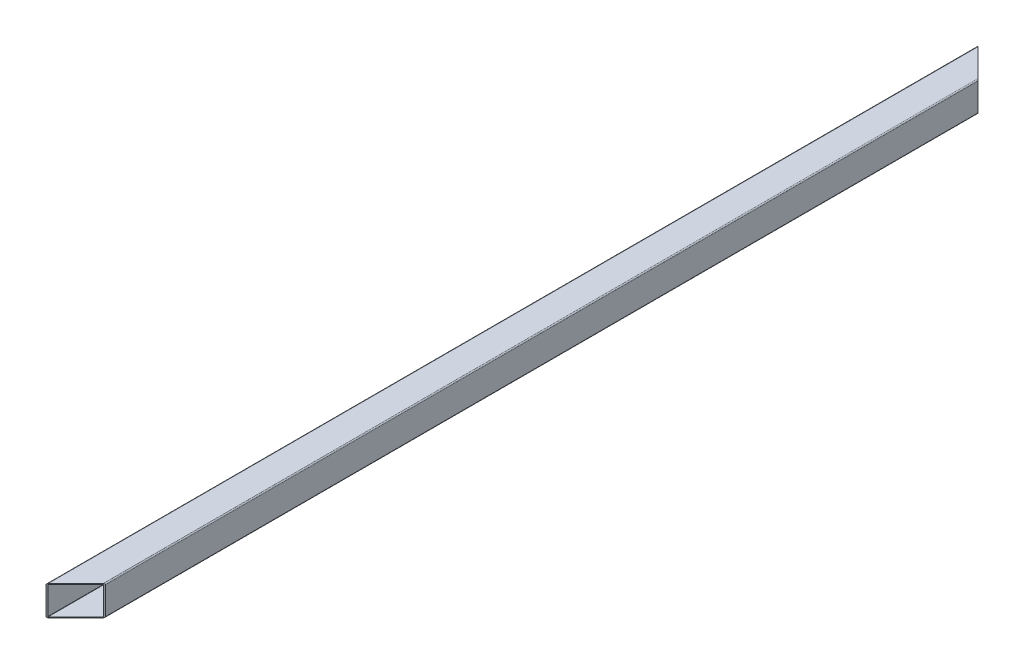
ISO-10303-21;
HEADER;
FILE_DESCRIPTION(('STEP AP214'),'2;1');
FILE_NAME('part.step','',(''),(''),'','','');
FILE_SCHEMA(('AUTOMOTIVE_DESIGN { 1 0 10303 214 1 1 1 1 }'));
ENDSEC;
DATA;
#1=APPLICATION_CONTEXT('core data for automotive mechanical design processes');
#2=APPLICATION_PROTOCOL_DEFINITION('international standard','automotive_design',2000,#1);
#3=PRODUCT_CONTEXT('',#1,'mechanical');
#4=PRODUCT('Part','Part','',(#3));
#5=PRODUCT_RELATED_PRODUCT_CATEGORY('part','',(#4));
#6=PRODUCT_DEFINITION_FORMATION('','',#4);
#7=PRODUCT_DEFINITION_CONTEXT('part definition',#1,'design');
#8=PRODUCT_DEFINITION('design','',#6,#7);
#9=PRODUCT_DEFINITION_SHAPE('','',#8);
#10=(LENGTH_UNIT() NAMED_UNIT(*) SI_UNIT(.MILLI.,.METRE.));
#11=(NAMED_UNIT(*) PLANE_ANGLE_UNIT() SI_UNIT($,.RADIAN.));
#12=(NAMED_UNIT(*) SI_UNIT($,.STERADIAN.) SOLID_ANGLE_UNIT());
#13=UNCERTAINTY_MEASURE_WITH_UNIT(LENGTH_MEASURE(1.E-05),#10,'distance_accuracy_value','');
#14=(GEOMETRIC_REPRESENTATION_CONTEXT(3) GLOBAL_UNCERTAINTY_ASSIGNED_CONTEXT((#13)) GLOBAL_UNIT_ASSIGNED_CONTEXT((#10,
#11,#12)) REPRESENTATION_CONTEXT('',''));
#15=CARTESIAN_POINT('',(0.,0.,0.));
#16=DIRECTION('',(0.,0.,1.));
#17=DIRECTION('',(1.,0.,0.));
#18=AXIS2_PLACEMENT_3D('',#15,#16,#17);
#19=CARTESIAN_POINT('',(-18.5,18.5,-1255.));
#20=DIRECTION('',(0.,0.,1.));
#21=DIRECTION('',(1.,0.,0.));
#22=AXIS2_PLACEMENT_3D('',#19,#20,#21);
#23=CYLINDRICAL_SURFACE('',#22,1.5);
#24=DIRECTION('',(0.,0.,1.));
#25=VECTOR('',#24,1.);
#26=CARTESIAN_POINT('',(-20.,18.5,-1255.));
#27=LINE('',#26,#25);
#28=CARTESIAN_POINT('',(-20.,18.5,-1255.));
#29=VERTEX_POINT('',#28);
#30=CARTESIAN_POINT('',(-20.,18.5,0.));
#31=VERTEX_POINT('',#30);
#32=EDGE_CURVE('E231',#29,#31,#27,.T.);
#33=ORIENTED_EDGE('',*,*,#32,.T.);
#34=CARTESIAN_POINT('',(-18.5,18.5,-1.50000000000006));
#35=DIRECTION('',(-0.707106781186548,0.,-0.707106781186547));
#36=DIRECTION('',(-0.707106781186547,0.,0.707106781186548));
#37=AXIS2_PLACEMENT_3D('',#34,#35,#36);
#38=ELLIPSE('',#37,2.12132034355964,1.5);
#39=CARTESIAN_POINT('',(-18.5,20.,-1.50000000000005));
#40=VERTEX_POINT('',#39);
#41=EDGE_CURVE('E188',#31,#40,#38,.T.);
#42=ORIENTED_EDGE('',*,*,#41,.T.);
#43=DIRECTION('',(0.,0.,1.));
#44=VECTOR('',#43,1.);
#45=CARTESIAN_POINT('',(-18.5,20.,-1255.));
#46=LINE('',#45,#44);
#47=CARTESIAN_POINT('',(-18.5,20.,-1253.5));
#48=VERTEX_POINT('',#47);
#49=EDGE_CURVE('E12',#48,#40,#46,.T.);
#50=ORIENTED_EDGE('',*,*,#49,.F.);
#51=CARTESIAN_POINT('',(-18.5,18.5,-1253.5));
#52=DIRECTION('',(-0.707106781186548,0.,0.707106781186547));
#53=DIRECTION('',(0.707106781186547,0.,0.707106781186548));
#54=AXIS2_PLACEMENT_3D('',#51,#52,#53);
#55=ELLIPSE('',#54,2.12132034355964,1.5);
#56=EDGE_CURVE('E298',#48,#29,#55,.T.);
#57=ORIENTED_EDGE('',*,*,#56,.T.);
#58=EDGE_LOOP('',(#33,#42,#50,#57));
#59=FACE_BOUND('',#58,.T.);
#60=ADVANCED_FACE('F63',(#59),#23,.T.);
#61=CARTESIAN_POINT('',(-18.5,20.,-1255.));
#62=DIRECTION('',(0.,-1.,0.));
#63=DIRECTION('',(0.,0.,-1.));
#64=AXIS2_PLACEMENT_3D('',#61,#62,#63);
#65=PLANE('',#64);
#66=ORIENTED_EDGE('',*,*,#49,.T.);
#67=DIRECTION('',(-0.707106781186547,0.,0.707106781186548));
#68=VECTOR('',#67,1.);
#69=CARTESIAN_POINT('',(-20.,20.,0.));
#70=LINE('',#69,#68);
#71=CARTESIAN_POINT('',(18.5,20.,-38.5000000000001));
#72=VERTEX_POINT('',#71);
#73=EDGE_CURVE('E180',#72,#40,#70,.T.);
#74=ORIENTED_EDGE('',*,*,#73,.F.);
#75=DIRECTION('',(0.,0.,1.));
#76=VECTOR('',#75,1.);
#77=CARTESIAN_POINT('',(18.5,20.,-1255.));
#78=LINE('',#77,#76);
#79=CARTESIAN_POINT('',(18.5,20.,-1216.5));
#80=VERTEX_POINT('',#79);
#81=EDGE_CURVE('E72',#80,#72,#78,.T.);
#82=ORIENTED_EDGE('',*,*,#81,.F.);
#83=DIRECTION('',(0.707106781186547,0.,0.707106781186548));
#84=VECTOR('',#83,1.);
#85=CARTESIAN_POINT('',(-20.,20.,-1255.));
#86=LINE('',#85,#84);
#87=EDGE_CURVE('E272',#48,#80,#86,.T.);
#88=ORIENTED_EDGE('',*,*,#87,.F.);
#89=EDGE_LOOP('',(#66,#74,#82,#88));
#90=FACE_BOUND('',#89,.T.);
#91=ADVANCED_FACE('F192',(#90),#65,.F.);
#92=CARTESIAN_POINT('',(18.5,18.5,-1255.));
#93=DIRECTION('',(0.,0.,1.));
#94=DIRECTION('',(1.,0.,0.));
#95=AXIS2_PLACEMENT_3D('',#92,#93,#94);
#96=CYLINDRICAL_SURFACE('',#95,1.5);
#97=ORIENTED_EDGE('',*,*,#81,.T.);
#98=CARTESIAN_POINT('',(18.5,18.5,-38.5000000000002));
#99=DIRECTION('',(-0.707106781186548,0.,-0.707106781186547));
#100=DIRECTION('',(-0.707106781186547,0.,0.707106781186548));
#101=AXIS2_PLACEMENT_3D('',#98,#99,#100);
#102=ELLIPSE('',#101,2.12132034355964,1.5);
#103=CARTESIAN_POINT('',(20.,18.5,-40.));
#104=VERTEX_POINT('',#103);
#105=EDGE_CURVE('E177',#72,#104,#102,.T.);
#106=ORIENTED_EDGE('',*,*,#105,.T.);
#107=DIRECTION('',(0.,0.,1.));
#108=VECTOR('',#107,1.);
#109=CARTESIAN_POINT('',(20.,18.5,-1255.));
#110=LINE('',#109,#108);
#111=CARTESIAN_POINT('',(20.,18.5,-1215.));
#112=VERTEX_POINT('',#111);
#113=EDGE_CURVE('E200',#112,#104,#110,.T.);
#114=ORIENTED_EDGE('',*,*,#113,.F.);
#115=CARTESIAN_POINT('',(18.5,18.5,-1216.5));
#116=DIRECTION('',(-0.707106781186548,0.,0.707106781186547));
#117=DIRECTION('',(0.707106781186547,0.,0.707106781186548));
#118=AXIS2_PLACEMENT_3D('',#115,#116,#117);
#119=ELLIPSE('',#118,2.12132034355964,1.5);
#120=EDGE_CURVE('E199',#112,#80,#119,.T.);
#121=ORIENTED_EDGE('',*,*,#120,.T.);
#122=EDGE_LOOP('',(#97,#106,#114,#121));
#123=FACE_BOUND('',#122,.T.);
#124=ADVANCED_FACE('F198',(#123),#96,.T.);
#125=CARTESIAN_POINT('',(20.,-18.5,-1255.));
#126=DIRECTION('',(-1.,0.,0.));
#127=DIRECTION('',(0.,0.,1.));
#128=AXIS2_PLACEMENT_3D('',#125,#126,#127);
#129=PLANE('',#128);
#130=ORIENTED_EDGE('',*,*,#113,.T.);
#131=DIRECTION('',(0.,-1.,0.));
#132=VECTOR('',#131,1.);
#133=CARTESIAN_POINT('',(20.,-18.5,-40.));
#134=LINE('',#133,#132);
#135=CARTESIAN_POINT('',(20.,-18.5,-40.0000000000003));
#136=VERTEX_POINT('',#135);
#137=EDGE_CURVE('E183',#104,#136,#134,.T.);
#138=ORIENTED_EDGE('',*,*,#137,.T.);
#139=DIRECTION('',(0.,0.,1.));
#140=VECTOR('',#139,1.);
#141=CARTESIAN_POINT('',(20.,-18.5,-1255.));
#142=LINE('',#141,#140);
#143=CARTESIAN_POINT('',(20.,-18.5,-1215.));
#144=VERTEX_POINT('',#143);
#145=EDGE_CURVE('E202',#144,#136,#142,.T.);
#146=ORIENTED_EDGE('',*,*,#145,.F.);
#147=DIRECTION('',(0.,1.,0.));
#148=VECTOR('',#147,1.);
#149=CARTESIAN_POINT('',(20.,-18.5,-1215.));
#150=LINE('',#149,#148);
#151=EDGE_CURVE('E265',#144,#112,#150,.T.);
#152=ORIENTED_EDGE('',*,*,#151,.T.);
#153=EDGE_LOOP('',(#130,#138,#146,#152));
#154=FACE_BOUND('',#153,.T.);
#155=ADVANCED_FACE('F264',(#154),#129,.F.);
#156=CARTESIAN_POINT('',(18.5,-18.5,-1255.));
#157=DIRECTION('',(0.,0.,1.));
#158=DIRECTION('',(1.,0.,0.));
#159=AXIS2_PLACEMENT_3D('',#156,#157,#158);
#160=CYLINDRICAL_SURFACE('',#159,1.5);
#161=ORIENTED_EDGE('',*,*,#145,.T.);
#162=CARTESIAN_POINT('',(18.5,-18.5,-38.5000000000002));
#163=DIRECTION('',(-0.707106781186548,0.,-0.707106781186547));
#164=DIRECTION('',(-0.707106781186547,0.,0.707106781186548));
#165=AXIS2_PLACEMENT_3D('',#162,#163,#164);
#166=ELLIPSE('',#165,2.12132034355964,1.5);
#167=CARTESIAN_POINT('',(18.5,-20.,-38.5000000000003));
#168=VERTEX_POINT('',#167);
#169=EDGE_CURVE('E260',#136,#168,#166,.T.);
#170=ORIENTED_EDGE('',*,*,#169,.T.);
#171=DIRECTION('',(0.,0.,1.));
#172=VECTOR('',#171,1.);
#173=CARTESIAN_POINT('',(18.5,-20.,-1255.));
#174=LINE('',#173,#172);
#175=CARTESIAN_POINT('',(18.5,-20.,-1216.5));
#176=VERTEX_POINT('',#175);
#177=EDGE_CURVE('E251',#176,#168,#174,.T.);
#178=ORIENTED_EDGE('',*,*,#177,.F.);
#179=CARTESIAN_POINT('',(18.5,-18.5,-1216.5));
#180=DIRECTION('',(-0.707106781186548,0.,0.707106781186547));
#181=DIRECTION('',(0.707106781186547,0.,0.707106781186548));
#182=AXIS2_PLACEMENT_3D('',#179,#180,#181);
#183=ELLIPSE('',#182,2.12132034355964,1.5);
#184=EDGE_CURVE('E261',#176,#144,#183,.T.);
#185=ORIENTED_EDGE('',*,*,#184,.T.);
#186=EDGE_LOOP('',(#161,#170,#178,#185));
#187=FACE_BOUND('',#186,.T.);
#188=ADVANCED_FACE('F258',(#187),#160,.T.);
#189=CARTESIAN_POINT('',(18.5,-20.,-1255.));
#190=DIRECTION('',(0.,1.,0.));
#191=DIRECTION('',(0.,0.,1.));
#192=AXIS2_PLACEMENT_3D('',#189,#190,#191);
#193=PLANE('',#192);
#194=ORIENTED_EDGE('',*,*,#177,.T.);
#195=DIRECTION('',(-0.707106781186547,0.,0.707106781186548));
#196=VECTOR('',#195,1.);
#197=CARTESIAN_POINT('',(626.75,-20.,-646.750000000001));
#198=LINE('',#197,#196);
#199=CARTESIAN_POINT('',(-18.5,-20.,-1.50000000000006));
#200=VERTEX_POINT('',#199);
#201=EDGE_CURVE('E267',#168,#200,#198,.T.);
#202=ORIENTED_EDGE('',*,*,#201,.T.);
#203=DIRECTION('',(0.,0.,1.));
#204=VECTOR('',#203,1.);
#205=CARTESIAN_POINT('',(-18.5,-20.,-1255.));
#206=LINE('',#205,#204);
#207=CARTESIAN_POINT('',(-18.5,-20.,-1253.5));
#208=VERTEX_POINT('',#207);
#209=EDGE_CURVE('E243',#208,#200,#206,.T.);
#210=ORIENTED_EDGE('',*,*,#209,.F.);
#211=DIRECTION('',(0.707106781186547,0.,0.707106781186548));
#212=VECTOR('',#211,1.);
#213=CARTESIAN_POINT('',(-0.750000000000046,-20.,-1235.75));
#214=LINE('',#213,#212);
#215=EDGE_CURVE('E292',#208,#176,#214,.T.);
#216=ORIENTED_EDGE('',*,*,#215,.T.);
#217=EDGE_LOOP('',(#194,#202,#210,#216));
#218=FACE_BOUND('',#217,.T.);
#219=ADVANCED_FACE('F345',(#218),#193,.F.);
#220=CARTESIAN_POINT('',(-18.5,-18.5,-1255.));
#221=DIRECTION('',(0.,0.,1.));
#222=DIRECTION('',(1.,0.,0.));
#223=AXIS2_PLACEMENT_3D('',#220,#221,#222);
#224=CYLINDRICAL_SURFACE('',#223,1.5);
#225=ORIENTED_EDGE('',*,*,#209,.T.);
#226=CARTESIAN_POINT('',(-18.5,-18.5,-1.50000000000006));
#227=DIRECTION('',(-0.707106781186548,0.,-0.707106781186547));
#228=DIRECTION('',(-0.707106781186547,0.,0.707106781186548));
#229=AXIS2_PLACEMENT_3D('',#226,#227,#228);
#230=ELLIPSE('',#229,2.12132034355965,1.5);
#231=CARTESIAN_POINT('',(-20.,-18.5,0.));
#232=VERTEX_POINT('',#231);
#233=EDGE_CURVE('E306',#200,#232,#230,.T.);
#234=ORIENTED_EDGE('',*,*,#233,.T.);
#235=DIRECTION('',(0.,0.,1.));
#236=VECTOR('',#235,1.);
#237=CARTESIAN_POINT('',(-20.,-18.5,-1255.));
#238=LINE('',#237,#236);
#239=CARTESIAN_POINT('',(-20.,-18.5,-1255.));
#240=VERTEX_POINT('',#239);
#241=EDGE_CURVE('E237',#240,#232,#238,.T.);
#242=ORIENTED_EDGE('',*,*,#241,.F.);
#243=CARTESIAN_POINT('',(-18.5,-18.5,-1253.5));
#244=DIRECTION('',(-0.707106781186548,0.,0.707106781186547));
#245=DIRECTION('',(0.707106781186547,0.,0.707106781186548));
#246=AXIS2_PLACEMENT_3D('',#243,#244,#245);
#247=ELLIPSE('',#246,2.12132034355965,1.5);
#248=EDGE_CURVE('E289',#240,#208,#247,.T.);
#249=ORIENTED_EDGE('',*,*,#248,.T.);
#250=EDGE_LOOP('',(#225,#234,#242,#249));
#251=FACE_BOUND('',#250,.T.);
#252=ADVANCED_FACE('F309',(#251),#224,.T.);
#253=CARTESIAN_POINT('',(18.5,18.5,-1255.));
#254=DIRECTION('',(0.,0.,1.));
#255=DIRECTION('',(1.,0.,0.));
#256=AXIS2_PLACEMENT_3D('',#253,#254,#255);
#257=CYLINDRICAL_SURFACE('',#256,0.3);
#258=CARTESIAN_POINT('',(18.5,18.5,-38.5000000000002));
#259=DIRECTION('',(-0.707106781186548,0.,-0.707106781186547));
#260=DIRECTION('',(-0.707106781186547,0.,0.707106781186548));
#261=AXIS2_PLACEMENT_3D('',#258,#259,#260);
#262=ELLIPSE('',#261,0.424264068711929,0.3);
#263=CARTESIAN_POINT('',(18.5,18.8,-38.5000000000002));
#264=VERTEX_POINT('',#263);
#265=CARTESIAN_POINT('',(18.8,18.5,-38.8000000000002));
#266=VERTEX_POINT('',#265);
#267=EDGE_CURVE('E80',#264,#266,#262,.T.);
#268=ORIENTED_EDGE('',*,*,#267,.F.);
#269=DIRECTION('',(0.,0.,1.));
#270=VECTOR('',#269,1.);
#271=CARTESIAN_POINT('',(18.5,18.8,-1255.));
#272=LINE('',#271,#270);
#273=CARTESIAN_POINT('',(18.5,18.8,-1216.5));
#274=VERTEX_POINT('',#273);
#275=EDGE_CURVE('E67',#274,#264,#272,.T.);
#276=ORIENTED_EDGE('',*,*,#275,.F.);
#277=CARTESIAN_POINT('',(18.5,18.5,-1216.5));
#278=DIRECTION('',(-0.707106781186548,0.,0.707106781186547));
#279=DIRECTION('',(0.707106781186547,0.,0.707106781186548));
#280=AXIS2_PLACEMENT_3D('',#277,#278,#279);
#281=ELLIPSE('',#280,0.424264068711929,0.3);
#282=CARTESIAN_POINT('',(18.8,18.5,-1216.2));
#283=VERTEX_POINT('',#282);
#284=EDGE_CURVE('E287',#283,#274,#281,.T.);
#285=ORIENTED_EDGE('',*,*,#284,.F.);
#286=DIRECTION('',(0.,0.,1.));
#287=VECTOR('',#286,1.);
#288=CARTESIAN_POINT('',(18.8,18.5,-1255.));
#289=LINE('',#288,#287);
#290=EDGE_CURVE('E206',#283,#266,#289,.T.);
#291=ORIENTED_EDGE('',*,*,#290,.T.);
#292=EDGE_LOOP('',(#268,#276,#285,#291));
#293=FACE_BOUND('',#292,.T.);
#294=ADVANCED_FACE('F65',(#293),#257,.F.);
#295=CARTESIAN_POINT('',(-18.5,18.8,-1255.));
#296=DIRECTION('',(0.,-1.,0.));
#297=DIRECTION('',(0.,0.,-1.));
#298=AXIS2_PLACEMENT_3D('',#295,#296,#297);
#299=PLANE('',#298);
#300=DIRECTION('',(0.707106781186547,0.,-0.707106781186548));
#301=VECTOR('',#300,1.);
#302=CARTESIAN_POINT('',(608.25,18.8,-628.250000000001));
#303=LINE('',#302,#301);
#304=CARTESIAN_POINT('',(-18.5,18.8,-1.50000000000006));
#305=VERTEX_POINT('',#304);
#306=EDGE_CURVE('E312',#305,#264,#303,.T.);
#307=ORIENTED_EDGE('',*,*,#306,.F.);
#308=DIRECTION('',(0.,0.,1.));
#309=VECTOR('',#308,1.);
#310=CARTESIAN_POINT('',(-18.5,18.8,-1255.));
#311=LINE('',#310,#309);
#312=CARTESIAN_POINT('',(-18.5,18.8,-1253.5));
#313=VERTEX_POINT('',#312);
#314=EDGE_CURVE('E224',#313,#305,#311,.T.);
#315=ORIENTED_EDGE('',*,*,#314,.F.);
#316=DIRECTION('',(-0.707106781186547,0.,-0.707106781186548));
#317=VECTOR('',#316,1.);
#318=CARTESIAN_POINT('',(-19.25,18.8,-1254.25));
#319=LINE('',#318,#317);
#320=EDGE_CURVE('E285',#274,#313,#319,.T.);
#321=ORIENTED_EDGE('',*,*,#320,.F.);
#322=ORIENTED_EDGE('',*,*,#275,.T.);
#323=EDGE_LOOP('',(#307,#315,#321,#322));
#324=FACE_BOUND('',#323,.T.);
#325=ADVANCED_FACE('F339',(#324),#299,.T.);
#326=CARTESIAN_POINT('',(-18.5,18.5,-1255.));
#327=DIRECTION('',(0.,0.,1.));
#328=DIRECTION('',(1.,0.,0.));
#329=AXIS2_PLACEMENT_3D('',#326,#327,#328);
#330=CYLINDRICAL_SURFACE('',#329,0.3);
#331=CARTESIAN_POINT('',(-18.5,18.5,-1.50000000000006));
#332=DIRECTION('',(-0.707106781186548,0.,-0.707106781186547));
#333=DIRECTION('',(-0.707106781186547,0.,0.707106781186548));
#334=AXIS2_PLACEMENT_3D('',#331,#332,#333);
#335=ELLIPSE('',#334,0.424264068711929,0.3);
#336=CARTESIAN_POINT('',(-18.8,18.5,-1.20000000000009));
#337=VERTEX_POINT('',#336);
#338=EDGE_CURVE('E316',#337,#305,#335,.T.);
#339=ORIENTED_EDGE('',*,*,#338,.F.);
#340=DIRECTION('',(0.,0.,1.));
#341=VECTOR('',#340,1.);
#342=CARTESIAN_POINT('',(-18.8,18.5,-1255.));
#343=LINE('',#342,#341);
#344=CARTESIAN_POINT('',(-18.8,18.5,-1253.8));
#345=VERTEX_POINT('',#344);
#346=EDGE_CURVE('E222',#345,#337,#343,.T.);
#347=ORIENTED_EDGE('',*,*,#346,.F.);
#348=CARTESIAN_POINT('',(-18.5,18.5,-1253.5));
#349=DIRECTION('',(-0.707106781186548,0.,0.707106781186547));
#350=DIRECTION('',(0.707106781186547,0.,0.707106781186548));
#351=AXIS2_PLACEMENT_3D('',#348,#349,#350);
#352=ELLIPSE('',#351,0.424264068711929,0.3);
#353=EDGE_CURVE('E283',#313,#345,#352,.T.);
#354=ORIENTED_EDGE('',*,*,#353,.F.);
#355=ORIENTED_EDGE('',*,*,#314,.T.);
#356=EDGE_LOOP('',(#339,#347,#354,#355));
#357=FACE_BOUND('',#356,.T.);
#358=ADVANCED_FACE('F344',(#357),#330,.F.);
#359=CARTESIAN_POINT('',(-18.8,18.5,-1255.));
#360=DIRECTION('',(1.,0.,0.));
#361=DIRECTION('',(0.,0.,-1.));
#362=AXIS2_PLACEMENT_3D('',#359,#360,#361);
#363=PLANE('',#362);
#364=DIRECTION('',(0.,1.,0.));
#365=VECTOR('',#364,1.);
#366=CARTESIAN_POINT('',(-18.8,18.5,-1.20000000000009));
#367=LINE('',#366,#365);
#368=CARTESIAN_POINT('',(-18.8,-18.5,-1.20000000000009));
#369=VERTEX_POINT('',#368);
#370=EDGE_CURVE('E318',#369,#337,#367,.T.);
#371=ORIENTED_EDGE('',*,*,#370,.F.);
#372=DIRECTION('',(0.,0.,1.));
#373=VECTOR('',#372,1.);
#374=CARTESIAN_POINT('',(-18.8,-18.5,-1255.));
#375=LINE('',#374,#373);
#376=CARTESIAN_POINT('',(-18.8,-18.5,-1253.8));
#377=VERTEX_POINT('',#376);
#378=EDGE_CURVE('E219',#377,#369,#375,.T.);
#379=ORIENTED_EDGE('',*,*,#378,.F.);
#380=DIRECTION('',(0.,-1.,0.));
#381=VECTOR('',#380,1.);
#382=CARTESIAN_POINT('',(-18.8,18.5,-1253.8));
#383=LINE('',#382,#381);
#384=EDGE_CURVE('E281',#345,#377,#383,.T.);
#385=ORIENTED_EDGE('',*,*,#384,.F.);
#386=ORIENTED_EDGE('',*,*,#346,.T.);
#387=EDGE_LOOP('',(#371,#379,#385,#386));
#388=FACE_BOUND('',#387,.T.);
#389=ADVANCED_FACE('F366',(#388),#363,.T.);
#390=CARTESIAN_POINT('',(-18.5,-18.5,-1255.));
#391=DIRECTION('',(0.,0.,1.));
#392=DIRECTION('',(1.,0.,0.));
#393=AXIS2_PLACEMENT_3D('',#390,#391,#392);
#394=CYLINDRICAL_SURFACE('',#393,0.300000000000005);
#395=CARTESIAN_POINT('',(-18.5,-18.5,-1.50000000000006));
#396=DIRECTION('',(-0.707106781186548,0.,-0.707106781186547));
#397=DIRECTION('',(-0.707106781186547,0.,0.707106781186548));
#398=AXIS2_PLACEMENT_3D('',#395,#396,#397);
#399=ELLIPSE('',#398,0.424264068711936,0.300000000000005);
#400=CARTESIAN_POINT('',(-18.5,-18.8,-1.50000000000017));
#401=VERTEX_POINT('',#400);
#402=EDGE_CURVE('E320',#401,#369,#399,.T.);
#403=ORIENTED_EDGE('',*,*,#402,.F.);
#404=DIRECTION('',(0.,0.,1.));
#405=VECTOR('',#404,1.);
#406=CARTESIAN_POINT('',(-18.5,-18.8,-1255.));
#407=LINE('',#406,#405);
#408=CARTESIAN_POINT('',(-18.5,-18.8,-1253.5));
#409=VERTEX_POINT('',#408);
#410=EDGE_CURVE('E216',#409,#401,#407,.T.);
#411=ORIENTED_EDGE('',*,*,#410,.F.);
#412=CARTESIAN_POINT('',(-18.5,-18.5,-1253.5));
#413=DIRECTION('',(-0.707106781186548,0.,0.707106781186547));
#414=DIRECTION('',(0.707106781186547,0.,0.707106781186548));
#415=AXIS2_PLACEMENT_3D('',#412,#413,#414);
#416=ELLIPSE('',#415,0.424264068711936,0.300000000000005);
#417=EDGE_CURVE('E279',#377,#409,#416,.T.);
#418=ORIENTED_EDGE('',*,*,#417,.F.);
#419=ORIENTED_EDGE('',*,*,#378,.T.);
#420=EDGE_LOOP('',(#403,#411,#418,#419));
#421=FACE_BOUND('',#420,.T.);
#422=ADVANCED_FACE('F362',(#421),#394,.F.);
#423=CARTESIAN_POINT('',(18.5,-18.8,-1255.));
#424=DIRECTION('',(0.,1.,0.));
#425=DIRECTION('',(0.,0.,1.));
#426=AXIS2_PLACEMENT_3D('',#423,#424,#425);
#427=PLANE('',#426);
#428=DIRECTION('',(-0.707106781186547,0.,0.707106781186548));
#429=VECTOR('',#428,1.);
#430=CARTESIAN_POINT('',(626.75,-18.8,-646.750000000001));
#431=LINE('',#430,#429);
#432=CARTESIAN_POINT('',(18.5,-18.8,-38.5000000000002));
#433=VERTEX_POINT('',#432);
#434=EDGE_CURVE('E322',#433,#401,#431,.T.);
#435=ORIENTED_EDGE('',*,*,#434,.F.);
#436=DIRECTION('',(0.,0.,1.));
#437=VECTOR('',#436,1.);
#438=CARTESIAN_POINT('',(18.5,-18.8,-1255.));
#439=LINE('',#438,#437);
#440=CARTESIAN_POINT('',(18.5,-18.8,-1216.5));
#441=VERTEX_POINT('',#440);
#442=EDGE_CURVE('E213',#441,#433,#439,.T.);
#443=ORIENTED_EDGE('',*,*,#442,.F.);
#444=DIRECTION('',(0.707106781186547,0.,0.707106781186548));
#445=VECTOR('',#444,1.);
#446=CARTESIAN_POINT('',(-0.750000000000046,-18.8,-1235.75));
#447=LINE('',#446,#445);
#448=EDGE_CURVE('E277',#409,#441,#447,.T.);
#449=ORIENTED_EDGE('',*,*,#448,.F.);
#450=ORIENTED_EDGE('',*,*,#410,.T.);
#451=EDGE_LOOP('',(#435,#443,#449,#450));
#452=FACE_BOUND('',#451,.T.);
#453=ADVANCED_FACE('F359',(#452),#427,.T.);
#454=CARTESIAN_POINT('',(18.5,-18.5,-1255.));
#455=DIRECTION('',(0.,0.,1.));
#456=DIRECTION('',(1.,0.,0.));
#457=AXIS2_PLACEMENT_3D('',#454,#455,#456);
#458=CYLINDRICAL_SURFACE('',#457,0.300000000000003);
#459=CARTESIAN_POINT('',(18.5,-18.5,-38.5000000000002));
#460=DIRECTION('',(-0.707106781186548,0.,-0.707106781186547));
#461=DIRECTION('',(-0.707106781186547,0.,0.707106781186548));
#462=AXIS2_PLACEMENT_3D('',#459,#460,#461);
#463=ELLIPSE('',#462,0.424264068711934,0.300000000000003);
#464=CARTESIAN_POINT('',(18.8,-18.5,-38.8000000000002));
#465=VERTEX_POINT('',#464);
#466=EDGE_CURVE('E324',#465,#433,#463,.T.);
#467=ORIENTED_EDGE('',*,*,#466,.F.);
#468=DIRECTION('',(0.,0.,1.));
#469=VECTOR('',#468,1.);
#470=CARTESIAN_POINT('',(18.8,-18.5,-1255.));
#471=LINE('',#470,#469);
#472=CARTESIAN_POINT('',(18.8,-18.5,-1216.2));
#473=VERTEX_POINT('',#472);
#474=EDGE_CURVE('E209',#473,#465,#471,.T.);
#475=ORIENTED_EDGE('',*,*,#474,.F.);
#476=CARTESIAN_POINT('',(18.5,-18.5,-1216.5));
#477=DIRECTION('',(-0.707106781186548,0.,0.707106781186547));
#478=DIRECTION('',(0.707106781186547,0.,0.707106781186548));
#479=AXIS2_PLACEMENT_3D('',#476,#477,#478);
#480=ELLIPSE('',#479,0.424264068711934,0.300000000000003);
#481=EDGE_CURVE('E88',#441,#473,#480,.T.);
#482=ORIENTED_EDGE('',*,*,#481,.F.);
#483=ORIENTED_EDGE('',*,*,#442,.T.);
#484=EDGE_LOOP('',(#467,#475,#482,#483));
#485=FACE_BOUND('',#484,.T.);
#486=ADVANCED_FACE('F332',(#485),#458,.F.);
#487=CARTESIAN_POINT('',(18.8,-18.5,-1255.));
#488=DIRECTION('',(-1.,0.,0.));
#489=DIRECTION('',(0.,0.,1.));
#490=AXIS2_PLACEMENT_3D('',#487,#488,#489);
#491=PLANE('',#490);
#492=DIRECTION('',(0.,-1.,0.));
#493=VECTOR('',#492,1.);
#494=CARTESIAN_POINT('',(18.8,-18.5,-38.8000000000002));
#495=LINE('',#494,#493);
#496=EDGE_CURVE('E195',#266,#465,#495,.T.);
#497=ORIENTED_EDGE('',*,*,#496,.F.);
#498=ORIENTED_EDGE('',*,*,#290,.F.);
#499=DIRECTION('',(0.,1.,0.));
#500=VECTOR('',#499,1.);
#501=CARTESIAN_POINT('',(18.8,-18.5,-1216.2));
#502=LINE('',#501,#500);
#503=EDGE_CURVE('E274',#473,#283,#502,.T.);
#504=ORIENTED_EDGE('',*,*,#503,.F.);
#505=ORIENTED_EDGE('',*,*,#474,.T.);
#506=EDGE_LOOP('',(#497,#498,#504,#505));
#507=FACE_BOUND('',#506,.T.);
#508=ADVANCED_FACE('F334',(#507),#491,.T.);
#509=CARTESIAN_POINT('',(-20.,18.5,-1255.));
#510=DIRECTION('',(1.,0.,0.));
#511=DIRECTION('',(0.,0.,-1.));
#512=AXIS2_PLACEMENT_3D('',#509,#510,#511);
#513=PLANE('',#512);
#514=DIRECTION('',(0.,1.,0.));
#515=VECTOR('',#514,1.);
#516=CARTESIAN_POINT('',(-20.,18.5,0.));
#517=LINE('',#516,#515);
#518=EDGE_CURVE('E246',#232,#31,#517,.T.);
#519=ORIENTED_EDGE('',*,*,#518,.T.);
#520=ORIENTED_EDGE('',*,*,#32,.F.);
#521=DIRECTION('',(0.,1.,0.));
#522=VECTOR('',#521,1.);
#523=CARTESIAN_POINT('',(-20.,18.5,-1255.));
#524=LINE('',#523,#522);
#525=EDGE_CURVE('E210',#240,#29,#524,.T.);
#526=ORIENTED_EDGE('',*,*,#525,.F.);
#527=ORIENTED_EDGE('',*,*,#241,.T.);
#528=EDGE_LOOP('',(#519,#520,#526,#527));
#529=FACE_BOUND('',#528,.T.);
#530=ADVANCED_FACE('F303',(#529),#513,.F.);
#531=CARTESIAN_POINT('',(-20.,-30.,-1255.));
#532=DIRECTION('',(-0.707106781186548,0.,0.707106781186547));
#533=DIRECTION('',(0.707106781186547,0.,0.707106781186548));
#534=AXIS2_PLACEMENT_3D('',#531,#532,#533);
#535=PLANE('',#534);
#536=ORIENTED_EDGE('',*,*,#284,.T.);
#537=ORIENTED_EDGE('',*,*,#320,.T.);
#538=ORIENTED_EDGE('',*,*,#353,.T.);
#539=ORIENTED_EDGE('',*,*,#384,.T.);
#540=ORIENTED_EDGE('',*,*,#417,.T.);
#541=ORIENTED_EDGE('',*,*,#448,.T.);
#542=ORIENTED_EDGE('',*,*,#481,.T.);
#543=ORIENTED_EDGE('',*,*,#503,.T.);
#544=EDGE_LOOP('',(#536,#537,#538,#539,#540,#541,#542,#543));
#545=FACE_BOUND('',#544,.T.);
#546=ORIENTED_EDGE('',*,*,#87,.T.);
#547=ORIENTED_EDGE('',*,*,#120,.F.);
#548=ORIENTED_EDGE('',*,*,#151,.F.);
#549=ORIENTED_EDGE('',*,*,#184,.F.);
#550=ORIENTED_EDGE('',*,*,#215,.F.);
#551=ORIENTED_EDGE('',*,*,#248,.F.);
#552=ORIENTED_EDGE('',*,*,#525,.T.);
#553=ORIENTED_EDGE('',*,*,#56,.F.);
#554=EDGE_LOOP('',(#546,#547,#548,#549,#550,#551,#552,#553));
#555=FACE_BOUND('',#554,.T.);
#556=ADVANCED_FACE('F336',(#545,#555),#535,.F.);
#557=CARTESIAN_POINT('',(-20.,-30.,0.));
#558=DIRECTION('',(-0.707106781186548,0.,-0.707106781186547));
#559=DIRECTION('',(-0.707106781186547,0.,0.707106781186548));
#560=AXIS2_PLACEMENT_3D('',#557,#558,#559);
#561=PLANE('',#560);
#562=ORIENTED_EDGE('',*,*,#267,.T.);
#563=ORIENTED_EDGE('',*,*,#496,.T.);
#564=ORIENTED_EDGE('',*,*,#466,.T.);
#565=ORIENTED_EDGE('',*,*,#434,.T.);
#566=ORIENTED_EDGE('',*,*,#402,.T.);
#567=ORIENTED_EDGE('',*,*,#370,.T.);
#568=ORIENTED_EDGE('',*,*,#338,.T.);
#569=ORIENTED_EDGE('',*,*,#306,.T.);
#570=EDGE_LOOP('',(#562,#563,#564,#565,#566,#567,#568,#569));
#571=FACE_BOUND('',#570,.T.);
#572=ORIENTED_EDGE('',*,*,#518,.F.);
#573=ORIENTED_EDGE('',*,*,#233,.F.);
#574=ORIENTED_EDGE('',*,*,#201,.F.);
#575=ORIENTED_EDGE('',*,*,#169,.F.);
#576=ORIENTED_EDGE('',*,*,#137,.F.);
#577=ORIENTED_EDGE('',*,*,#105,.F.);
#578=ORIENTED_EDGE('',*,*,#73,.T.);
#579=ORIENTED_EDGE('',*,*,#41,.F.);
#580=EDGE_LOOP('',(#572,#573,#574,#575,#576,#577,#578,#579));
#581=FACE_BOUND('',#580,.T.);
#582=ADVANCED_FACE('F179',(#571,#581),#561,.F.);
#583=CLOSED_SHELL('',(#60,#91,#124,#155,#188,#219,#252,#294,#325,#358,#389,#422,#453,#486,#508,
#530,#556,#582));
#584=MANIFOLD_SOLID_BREP('B2',#583);
#585=ADVANCED_BREP_SHAPE_REPRESENTATION('',(#18,#584),#14);
#586=SHAPE_DEFINITION_REPRESENTATION(#9,#585);
ENDSEC;
END-ISO-10303-21;
